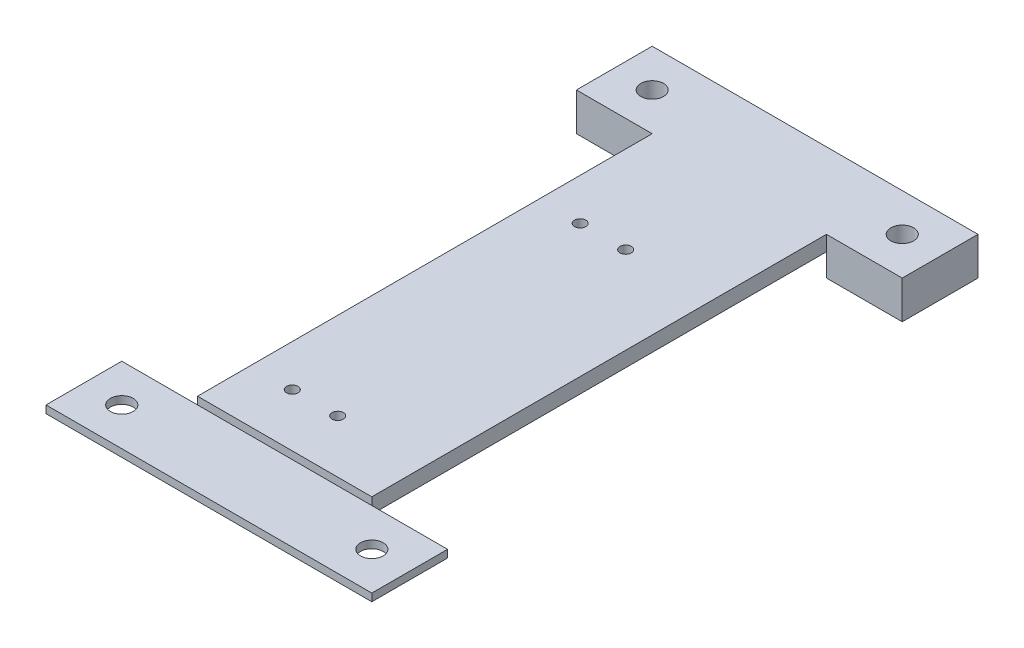
ISO-10303-21;
HEADER;
FILE_DESCRIPTION(('STEP AP214'),'2;1');
FILE_NAME('part.step','',(''),(''),'','','');
FILE_SCHEMA(('AUTOMOTIVE_DESIGN { 1 0 10303 214 1 1 1 1 }'));
ENDSEC;
DATA;
#1=APPLICATION_CONTEXT('core data for automotive mechanical design processes');
#2=APPLICATION_PROTOCOL_DEFINITION('international standard','automotive_design',2000,#1);
#3=PRODUCT_CONTEXT('',#1,'mechanical');
#4=PRODUCT('Part','Part','',(#3));
#5=PRODUCT_RELATED_PRODUCT_CATEGORY('part','',(#4));
#6=PRODUCT_DEFINITION_FORMATION('','',#4);
#7=PRODUCT_DEFINITION_CONTEXT('part definition',#1,'design');
#8=PRODUCT_DEFINITION('design','',#6,#7);
#9=PRODUCT_DEFINITION_SHAPE('','',#8);
#10=(LENGTH_UNIT() NAMED_UNIT(*) SI_UNIT(.MILLI.,.METRE.));
#11=(NAMED_UNIT(*) PLANE_ANGLE_UNIT() SI_UNIT($,.RADIAN.));
#12=(NAMED_UNIT(*) SI_UNIT($,.STERADIAN.) SOLID_ANGLE_UNIT());
#13=UNCERTAINTY_MEASURE_WITH_UNIT(LENGTH_MEASURE(1.E-05),#10,'distance_accuracy_value','');
#14=(GEOMETRIC_REPRESENTATION_CONTEXT(3) GLOBAL_UNCERTAINTY_ASSIGNED_CONTEXT((#13)) GLOBAL_UNIT_ASSIGNED_CONTEXT((#10,
#11,#12)) REPRESENTATION_CONTEXT('',''));
#15=CARTESIAN_POINT('',(0.,0.,0.));
#16=DIRECTION('',(0.,0.,1.));
#17=DIRECTION('',(1.,0.,0.));
#18=AXIS2_PLACEMENT_3D('',#15,#16,#17);
#19=CARTESIAN_POINT('',(20.,4.,-120.));
#20=DIRECTION('',(1.,0.,0.));
#21=DIRECTION('',(0.,0.,-1.));
#22=AXIS2_PLACEMENT_3D('',#19,#20,#21);
#23=PLANE('',#22);
#24=DIRECTION('',(0.,-1.,0.));
#25=VECTOR('',#24,1.);
#26=CARTESIAN_POINT('',(20.,0.,0.));
#27=LINE('',#26,#25);
#28=CARTESIAN_POINT('',(20.,2.,0.));
#29=VERTEX_POINT('',#28);
#30=CARTESIAN_POINT('',(20.,0.,0.));
#31=VERTEX_POINT('',#30);
#32=EDGE_CURVE('E173',#29,#31,#27,.T.);
#33=ORIENTED_EDGE('',*,*,#32,.F.);
#34=DIRECTION('',(0.,-1.,0.));
#35=VECTOR('',#34,1.);
#36=CARTESIAN_POINT('',(20.,4.,0.));
#37=LINE('',#36,#35);
#38=CARTESIAN_POINT('',(20.,4.,0.));
#39=VERTEX_POINT('',#38);
#40=EDGE_CURVE('E308',#39,#29,#37,.T.);
#41=ORIENTED_EDGE('',*,*,#40,.F.);
#42=DIRECTION('',(0.,0.,1.));
#43=VECTOR('',#42,1.);
#44=CARTESIAN_POINT('',(20.,4.,-120.));
#45=LINE('',#44,#43);
#46=CARTESIAN_POINT('',(20.,4.,-120.));
#47=VERTEX_POINT('',#46);
#48=EDGE_CURVE('E279',#47,#39,#45,.T.);
#49=ORIENTED_EDGE('',*,*,#48,.F.);
#50=DIRECTION('',(0.,-1.,0.));
#51=VECTOR('',#50,1.);
#52=CARTESIAN_POINT('',(20.,4.,-120.));
#53=LINE('',#52,#51);
#54=CARTESIAN_POINT('',(20.,0.,-120.));
#55=VERTEX_POINT('',#54);
#56=EDGE_CURVE('E42',#47,#55,#53,.T.);
#57=ORIENTED_EDGE('',*,*,#56,.T.);
#58=DIRECTION('',(0.,0.,1.));
#59=VECTOR('',#58,1.);
#60=CARTESIAN_POINT('',(20.,0.,-120.));
#61=LINE('',#60,#59);
#62=EDGE_CURVE('E273',#55,#31,#61,.T.);
#63=ORIENTED_EDGE('',*,*,#62,.T.);
#64=EDGE_LOOP('',(#33,#41,#49,#57,#63));
#65=FACE_BOUND('',#64,.T.);
#66=ADVANCED_FACE('F34',(#65),#23,.F.);
#67=CARTESIAN_POINT('',(66.,4.,-120.));
#68=DIRECTION('',(-1.,0.,0.));
#69=DIRECTION('',(0.,0.,1.));
#70=AXIS2_PLACEMENT_3D('',#67,#68,#69);
#71=PLANE('',#70);
#72=DIRECTION('',(0.,1.,0.));
#73=VECTOR('',#72,1.);
#74=CARTESIAN_POINT('',(66.,2.,0.));
#75=LINE('',#74,#73);
#76=CARTESIAN_POINT('',(66.,0.,0.));
#77=VERTEX_POINT('',#76);
#78=CARTESIAN_POINT('',(66.,2.,0.));
#79=VERTEX_POINT('',#78);
#80=EDGE_CURVE('E186',#77,#79,#75,.T.);
#81=ORIENTED_EDGE('',*,*,#80,.F.);
#82=DIRECTION('',(0.,0.,-1.));
#83=VECTOR('',#82,1.);
#84=CARTESIAN_POINT('',(66.,0.,-120.));
#85=LINE('',#84,#83);
#86=CARTESIAN_POINT('',(66.,0.,-120.));
#87=VERTEX_POINT('',#86);
#88=EDGE_CURVE('E294',#77,#87,#85,.T.);
#89=ORIENTED_EDGE('',*,*,#88,.T.);
#90=DIRECTION('',(0.,-1.,0.));
#91=VECTOR('',#90,1.);
#92=CARTESIAN_POINT('',(66.,4.,-120.));
#93=LINE('',#92,#91);
#94=CARTESIAN_POINT('',(66.,4.,-120.));
#95=VERTEX_POINT('',#94);
#96=EDGE_CURVE('E302',#95,#87,#93,.T.);
#97=ORIENTED_EDGE('',*,*,#96,.F.);
#98=DIRECTION('',(0.,0.,-1.));
#99=VECTOR('',#98,1.);
#100=CARTESIAN_POINT('',(66.,4.,-120.));
#101=LINE('',#100,#99);
#102=CARTESIAN_POINT('',(66.,4.,0.));
#103=VERTEX_POINT('',#102);
#104=EDGE_CURVE('E283',#103,#95,#101,.T.);
#105=ORIENTED_EDGE('',*,*,#104,.F.);
#106=DIRECTION('',(0.,-1.,0.));
#107=VECTOR('',#106,1.);
#108=CARTESIAN_POINT('',(66.,4.,0.));
#109=LINE('',#108,#107);
#110=EDGE_CURVE('E305',#103,#79,#109,.T.);
#111=ORIENTED_EDGE('',*,*,#110,.T.);
#112=EDGE_LOOP('',(#81,#89,#97,#105,#111));
#113=FACE_BOUND('',#112,.T.);
#114=ADVANCED_FACE('F352',(#113),#71,.F.);
#115=CARTESIAN_POINT('',(66.,4.,0.));
#116=DIRECTION('',(0.,0.,-1.));
#117=DIRECTION('',(-1.,0.,0.));
#118=AXIS2_PLACEMENT_3D('',#115,#116,#117);
#119=PLANE('',#118);
#120=DIRECTION('',(-1.,0.,0.));
#121=VECTOR('',#120,1.);
#122=CARTESIAN_POINT('',(20.,2.,0.));
#123=LINE('',#122,#121);
#124=EDGE_CURVE('E200',#79,#29,#123,.T.);
#125=ORIENTED_EDGE('',*,*,#124,.F.);
#126=ORIENTED_EDGE('',*,*,#110,.F.);
#127=DIRECTION('',(1.,0.,0.));
#128=VECTOR('',#127,1.);
#129=CARTESIAN_POINT('',(66.,4.,0.));
#130=LINE('',#129,#128);
#131=EDGE_CURVE('E281',#39,#103,#130,.T.);
#132=ORIENTED_EDGE('',*,*,#131,.F.);
#133=ORIENTED_EDGE('',*,*,#40,.T.);
#134=EDGE_LOOP('',(#125,#126,#132,#133));
#135=FACE_BOUND('',#134,.T.);
#136=ADVANCED_FACE('F357',(#135),#119,.F.);
#137=CARTESIAN_POINT('',(0.,0.,0.));
#138=DIRECTION('',(0.,1.,0.));
#139=DIRECTION('',(0.,0.,1.));
#140=AXIS2_PLACEMENT_3D('',#137,#138,#139);
#141=PLANE('',#140);
#142=CARTESIAN_POINT('',(10.,0.,10.));
#143=DIRECTION('',(0.,1.,0.));
#144=DIRECTION('',(0.,0.,1.));
#145=AXIS2_PLACEMENT_3D('',#142,#143,#144);
#146=CIRCLE('',#145,3.);
#147=CARTESIAN_POINT('',(10.,0.,13.));
#148=VERTEX_POINT('',#147);
#149=EDGE_CURVE('E175',#148,#148,#146,.T.);
#150=ORIENTED_EDGE('',*,*,#149,.T.);
#151=EDGE_LOOP('',(#150));
#152=FACE_BOUND('',#151,.T.);
#153=CARTESIAN_POINT('',(76.,0.,10.));
#154=DIRECTION('',(0.,1.,0.));
#155=DIRECTION('',(0.,0.,1.));
#156=AXIS2_PLACEMENT_3D('',#153,#154,#155);
#157=CIRCLE('',#156,3.00000000000001);
#158=CARTESIAN_POINT('',(76.,0.,13.));
#159=VERTEX_POINT('',#158);
#160=EDGE_CURVE('E447',#159,#159,#157,.T.);
#161=ORIENTED_EDGE('',*,*,#160,.T.);
#162=EDGE_LOOP('',(#161));
#163=FACE_BOUND('',#162,.T.);
#164=CARTESIAN_POINT('',(43.,0.,-90.));
#165=DIRECTION('',(0.,1.,0.));
#166=DIRECTION('',(0.,0.,1.));
#167=AXIS2_PLACEMENT_3D('',#164,#165,#166);
#168=CIRCLE('',#167,1.5);
#169=CARTESIAN_POINT('',(43.,0.,-88.5));
#170=VERTEX_POINT('',#169);
#171=EDGE_CURVE('E223',#170,#170,#168,.T.);
#172=ORIENTED_EDGE('',*,*,#171,.T.);
#173=EDGE_LOOP('',(#172));
#174=FACE_BOUND('',#173,.T.);
#175=CARTESIAN_POINT('',(31.,0.,-14.));
#176=DIRECTION('',(0.,1.,0.));
#177=DIRECTION('',(0.,0.,1.));
#178=AXIS2_PLACEMENT_3D('',#175,#176,#177);
#179=CIRCLE('',#178,1.5);
#180=CARTESIAN_POINT('',(31.,0.,-12.5));
#181=VERTEX_POINT('',#180);
#182=EDGE_CURVE('E220',#181,#181,#179,.T.);
#183=ORIENTED_EDGE('',*,*,#182,.T.);
#184=EDGE_LOOP('',(#183));
#185=FACE_BOUND('',#184,.T.);
#186=CARTESIAN_POINT('',(43.,0.,-14.));
#187=DIRECTION('',(0.,1.,0.));
#188=DIRECTION('',(0.,0.,1.));
#189=AXIS2_PLACEMENT_3D('',#186,#187,#188);
#190=CIRCLE('',#189,1.5);
#191=CARTESIAN_POINT('',(43.,0.,-12.5));
#192=VERTEX_POINT('',#191);
#193=EDGE_CURVE('E217',#192,#192,#190,.T.);
#194=ORIENTED_EDGE('',*,*,#193,.T.);
#195=EDGE_LOOP('',(#194));
#196=FACE_BOUND('',#195,.T.);
#197=CARTESIAN_POINT('',(31.,0.,-90.));
#198=DIRECTION('',(0.,1.,0.));
#199=DIRECTION('',(0.,0.,1.));
#200=AXIS2_PLACEMENT_3D('',#197,#198,#199);
#201=CIRCLE('',#200,1.5);
#202=CARTESIAN_POINT('',(31.,0.,-88.5));
#203=VERTEX_POINT('',#202);
#204=EDGE_CURVE('E214',#203,#203,#201,.T.);
#205=ORIENTED_EDGE('',*,*,#204,.T.);
#206=EDGE_LOOP('',(#205));
#207=FACE_BOUND('',#206,.T.);
#208=DIRECTION('',(0.,0.,-1.));
#209=VECTOR('',#208,1.);
#210=CARTESIAN_POINT('',(66.,0.,-140.));
#211=LINE('',#210,#209);
#212=CARTESIAN_POINT('',(66.,0.,-140.));
#213=VERTEX_POINT('',#212);
#214=EDGE_CURVE('E229',#87,#213,#211,.T.);
#215=ORIENTED_EDGE('',*,*,#214,.F.);
#216=ORIENTED_EDGE('',*,*,#88,.F.);
#217=DIRECTION('',(-1.,0.,0.));
#218=VECTOR('',#217,1.);
#219=CARTESIAN_POINT('',(86.,0.,0.));
#220=LINE('',#219,#218);
#221=CARTESIAN_POINT('',(86.,0.,0.));
#222=VERTEX_POINT('',#221);
#223=EDGE_CURVE('E198',#222,#77,#220,.T.);
#224=ORIENTED_EDGE('',*,*,#223,.F.);
#225=DIRECTION('',(0.,0.,-1.));
#226=VECTOR('',#225,1.);
#227=CARTESIAN_POINT('',(86.,0.,20.));
#228=LINE('',#227,#226);
#229=CARTESIAN_POINT('',(86.,0.,20.));
#230=VERTEX_POINT('',#229);
#231=EDGE_CURVE('E188',#230,#222,#228,.T.);
#232=ORIENTED_EDGE('',*,*,#231,.F.);
#233=DIRECTION('',(1.,0.,0.));
#234=VECTOR('',#233,1.);
#235=CARTESIAN_POINT('',(20.,0.,20.));
#236=LINE('',#235,#234);
#237=CARTESIAN_POINT('',(0.,0.,20.));
#238=VERTEX_POINT('',#237);
#239=EDGE_CURVE('E158',#238,#230,#236,.T.);
#240=ORIENTED_EDGE('',*,*,#239,.F.);
#241=DIRECTION('',(0.,0.,1.));
#242=VECTOR('',#241,1.);
#243=CARTESIAN_POINT('',(0.,0.,20.));
#244=LINE('',#243,#242);
#245=CARTESIAN_POINT('',(0.,0.,0.));
#246=VERTEX_POINT('',#245);
#247=EDGE_CURVE('E172',#246,#238,#244,.T.);
#248=ORIENTED_EDGE('',*,*,#247,.F.);
#249=DIRECTION('',(1.,0.,0.));
#250=VECTOR('',#249,1.);
#251=CARTESIAN_POINT('',(0.,0.,0.));
#252=LINE('',#251,#250);
#253=EDGE_CURVE('E181',#246,#31,#252,.T.);
#254=ORIENTED_EDGE('',*,*,#253,.T.);
#255=ORIENTED_EDGE('',*,*,#62,.F.);
#256=DIRECTION('',(0.,0.,1.));
#257=VECTOR('',#256,1.);
#258=CARTESIAN_POINT('',(20.,0.,-140.));
#259=LINE('',#258,#257);
#260=CARTESIAN_POINT('',(20.,0.,-140.));
#261=VERTEX_POINT('',#260);
#262=EDGE_CURVE('E248',#261,#55,#259,.T.);
#263=ORIENTED_EDGE('',*,*,#262,.F.);
#264=DIRECTION('',(-1.,0.,0.));
#265=VECTOR('',#264,1.);
#266=CARTESIAN_POINT('',(0.,0.,-140.));
#267=LINE('',#266,#265);
#268=EDGE_CURVE('E54',#213,#261,#267,.T.);
#269=ORIENTED_EDGE('',*,*,#268,.F.);
#270=EDGE_LOOP('',(#215,#216,#224,#232,#240,#248,#254,#255,#263,#269));
#271=FACE_BOUND('',#270,.T.);
#272=ADVANCED_FACE('F372',(#152,#163,#174,#185,#196,#207,#271),#141,.F.);
#273=CARTESIAN_POINT('',(0.,4.,0.));
#274=DIRECTION('',(0.,1.,0.));
#275=DIRECTION('',(0.,0.,1.));
#276=AXIS2_PLACEMENT_3D('',#273,#274,#275);
#277=PLANE('',#276);
#278=CARTESIAN_POINT('',(43.,4.,-90.));
#279=DIRECTION('',(0.,1.,0.));
#280=DIRECTION('',(0.,0.,1.));
#281=AXIS2_PLACEMENT_3D('',#278,#279,#280);
#282=CIRCLE('',#281,1.5);
#283=CARTESIAN_POINT('',(43.,4.,-88.5));
#284=VERTEX_POINT('',#283);
#285=EDGE_CURVE('E206',#284,#284,#282,.T.);
#286=ORIENTED_EDGE('',*,*,#285,.F.);
#287=EDGE_LOOP('',(#286));
#288=FACE_BOUND('',#287,.T.);
#289=CARTESIAN_POINT('',(31.,4.,-14.));
#290=DIRECTION('',(0.,1.,0.));
#291=DIRECTION('',(0.,0.,1.));
#292=AXIS2_PLACEMENT_3D('',#289,#290,#291);
#293=CIRCLE('',#292,1.5);
#294=CARTESIAN_POINT('',(31.,4.,-12.5));
#295=VERTEX_POINT('',#294);
#296=EDGE_CURVE('E205',#295,#295,#293,.T.);
#297=ORIENTED_EDGE('',*,*,#296,.F.);
#298=EDGE_LOOP('',(#297));
#299=FACE_BOUND('',#298,.T.);
#300=CARTESIAN_POINT('',(43.,4.,-14.));
#301=DIRECTION('',(0.,1.,0.));
#302=DIRECTION('',(0.,0.,1.));
#303=AXIS2_PLACEMENT_3D('',#300,#301,#302);
#304=CIRCLE('',#303,1.5);
#305=CARTESIAN_POINT('',(43.,4.,-12.5));
#306=VERTEX_POINT('',#305);
#307=EDGE_CURVE('E157',#306,#306,#304,.T.);
#308=ORIENTED_EDGE('',*,*,#307,.F.);
#309=EDGE_LOOP('',(#308));
#310=FACE_BOUND('',#309,.T.);
#311=CARTESIAN_POINT('',(31.,4.,-90.));
#312=DIRECTION('',(0.,1.,0.));
#313=DIRECTION('',(0.,0.,1.));
#314=AXIS2_PLACEMENT_3D('',#311,#312,#313);
#315=CIRCLE('',#314,1.5);
#316=CARTESIAN_POINT('',(31.,4.,-88.5));
#317=VERTEX_POINT('',#316);
#318=EDGE_CURVE('E209',#317,#317,#315,.T.);
#319=ORIENTED_EDGE('',*,*,#318,.F.);
#320=EDGE_LOOP('',(#319));
#321=FACE_BOUND('',#320,.T.);
#322=CARTESIAN_POINT('',(10.,4.,-130.));
#323=DIRECTION('',(0.,1.,0.));
#324=DIRECTION('',(0.,0.,1.));
#325=AXIS2_PLACEMENT_3D('',#322,#323,#324);
#326=CIRCLE('',#325,3.);
#327=CARTESIAN_POINT('',(10.,4.,-127.));
#328=VERTEX_POINT('',#327);
#329=EDGE_CURVE('E270',#328,#328,#326,.T.);
#330=ORIENTED_EDGE('',*,*,#329,.F.);
#331=EDGE_LOOP('',(#330));
#332=FACE_BOUND('',#331,.T.);
#333=DIRECTION('',(0.,0.,1.));
#334=VECTOR('',#333,1.);
#335=CARTESIAN_POINT('',(0.,4.,-140.));
#336=LINE('',#335,#334);
#337=CARTESIAN_POINT('',(0.,4.,-140.));
#338=VERTEX_POINT('',#337);
#339=CARTESIAN_POINT('',(0.,4.,-120.));
#340=VERTEX_POINT('',#339);
#341=EDGE_CURVE('E274',#338,#340,#336,.T.);
#342=ORIENTED_EDGE('',*,*,#341,.T.);
#343=DIRECTION('',(1.,0.,0.));
#344=VECTOR('',#343,1.);
#345=CARTESIAN_POINT('',(0.,4.,-120.));
#346=LINE('',#345,#344);
#347=EDGE_CURVE('E277',#340,#47,#346,.T.);
#348=ORIENTED_EDGE('',*,*,#347,.T.);
#349=ORIENTED_EDGE('',*,*,#48,.T.);
#350=ORIENTED_EDGE('',*,*,#131,.T.);
#351=ORIENTED_EDGE('',*,*,#104,.T.);
#352=DIRECTION('',(1.,0.,0.));
#353=VECTOR('',#352,1.);
#354=CARTESIAN_POINT('',(86.,4.,-120.));
#355=LINE('',#354,#353);
#356=CARTESIAN_POINT('',(86.,4.,-120.));
#357=VERTEX_POINT('',#356);
#358=EDGE_CURVE('E285',#95,#357,#355,.T.);
#359=ORIENTED_EDGE('',*,*,#358,.T.);
#360=DIRECTION('',(0.,0.,-1.));
#361=VECTOR('',#360,1.);
#362=CARTESIAN_POINT('',(86.,4.,-140.));
#363=LINE('',#362,#361);
#364=CARTESIAN_POINT('',(86.,4.,-140.));
#365=VERTEX_POINT('',#364);
#366=EDGE_CURVE('E287',#357,#365,#363,.T.);
#367=ORIENTED_EDGE('',*,*,#366,.T.);
#368=DIRECTION('',(-1.,0.,0.));
#369=VECTOR('',#368,1.);
#370=CARTESIAN_POINT('',(0.,4.,-140.));
#371=LINE('',#370,#369);
#372=EDGE_CURVE('E289',#365,#338,#371,.T.);
#373=ORIENTED_EDGE('',*,*,#372,.T.);
#374=EDGE_LOOP('',(#342,#348,#349,#350,#351,#359,#367,#373));
#375=FACE_BOUND('',#374,.T.);
#376=CARTESIAN_POINT('',(76.,4.,-130.));
#377=DIRECTION('',(0.,1.,0.));
#378=DIRECTION('',(0.,0.,1.));
#379=AXIS2_PLACEMENT_3D('',#376,#377,#378);
#380=CIRCLE('',#379,3.00000000000001);
#381=CARTESIAN_POINT('',(76.,4.,-127.));
#382=VERTEX_POINT('',#381);
#383=EDGE_CURVE('E267',#382,#382,#380,.T.);
#384=ORIENTED_EDGE('',*,*,#383,.F.);
#385=EDGE_LOOP('',(#384));
#386=FACE_BOUND('',#385,.T.);
#387=ADVANCED_FACE('F368',(#288,#299,#310,#321,#332,#375,#386),#277,.T.);
#388=CARTESIAN_POINT('',(0.,4.,-140.));
#389=DIRECTION('',(1.,0.,0.));
#390=DIRECTION('',(0.,0.,-1.));
#391=AXIS2_PLACEMENT_3D('',#388,#389,#390);
#392=PLANE('',#391);
#393=DIRECTION('',(0.,-1.,0.));
#394=VECTOR('',#393,1.);
#395=CARTESIAN_POINT('',(0.,4.,-140.));
#396=LINE('',#395,#394);
#397=CARTESIAN_POINT('',(0.,-6.,-140.));
#398=VERTEX_POINT('',#397);
#399=EDGE_CURVE('E291',#338,#398,#396,.T.);
#400=ORIENTED_EDGE('',*,*,#399,.T.);
#401=DIRECTION('',(0.,0.,-1.));
#402=VECTOR('',#401,1.);
#403=CARTESIAN_POINT('',(0.,-6.,-140.));
#404=LINE('',#403,#402);
#405=CARTESIAN_POINT('',(0.,-6.,-120.));
#406=VERTEX_POINT('',#405);
#407=EDGE_CURVE('E249',#406,#398,#404,.T.);
#408=ORIENTED_EDGE('',*,*,#407,.F.);
#409=DIRECTION('',(0.,-1.,0.));
#410=VECTOR('',#409,1.);
#411=CARTESIAN_POINT('',(0.,4.,-120.));
#412=LINE('',#411,#410);
#413=EDGE_CURVE('E11',#340,#406,#412,.T.);
#414=ORIENTED_EDGE('',*,*,#413,.F.);
#415=ORIENTED_EDGE('',*,*,#341,.F.);
#416=EDGE_LOOP('',(#400,#408,#414,#415));
#417=FACE_BOUND('',#416,.T.);
#418=ADVANCED_FACE('F36',(#417),#392,.F.);
#419=CARTESIAN_POINT('',(0.,4.,-120.));
#420=DIRECTION('',(0.,0.,-1.));
#421=DIRECTION('',(-1.,0.,0.));
#422=AXIS2_PLACEMENT_3D('',#419,#420,#421);
#423=PLANE('',#422);
#424=ORIENTED_EDGE('',*,*,#413,.T.);
#425=DIRECTION('',(-1.,0.,0.));
#426=VECTOR('',#425,1.);
#427=CARTESIAN_POINT('',(0.,-6.,-120.));
#428=LINE('',#427,#426);
#429=CARTESIAN_POINT('',(20.,-6.,-120.));
#430=VERTEX_POINT('',#429);
#431=EDGE_CURVE('E256',#430,#406,#428,.T.);
#432=ORIENTED_EDGE('',*,*,#431,.F.);
#433=DIRECTION('',(0.,1.,0.));
#434=VECTOR('',#433,1.);
#435=CARTESIAN_POINT('',(20.,-6.,-120.));
#436=LINE('',#435,#434);
#437=EDGE_CURVE('E259',#430,#55,#436,.T.);
#438=ORIENTED_EDGE('',*,*,#437,.T.);
#439=ORIENTED_EDGE('',*,*,#56,.F.);
#440=ORIENTED_EDGE('',*,*,#347,.F.);
#441=EDGE_LOOP('',(#424,#432,#438,#439,#440));
#442=FACE_BOUND('',#441,.T.);
#443=ADVANCED_FACE('F323',(#442),#423,.F.);
#444=CARTESIAN_POINT('',(86.,4.,-120.));
#445=DIRECTION('',(0.,0.,-1.));
#446=DIRECTION('',(-1.,0.,0.));
#447=AXIS2_PLACEMENT_3D('',#444,#445,#446);
#448=PLANE('',#447);
#449=ORIENTED_EDGE('',*,*,#96,.T.);
#450=DIRECTION('',(0.,1.,0.));
#451=VECTOR('',#450,1.);
#452=CARTESIAN_POINT('',(66.,-6.,-120.));
#453=LINE('',#452,#451);
#454=CARTESIAN_POINT('',(66.,-6.,-120.));
#455=VERTEX_POINT('',#454);
#456=EDGE_CURVE('E242',#455,#87,#453,.T.);
#457=ORIENTED_EDGE('',*,*,#456,.F.);
#458=DIRECTION('',(-1.,0.,0.));
#459=VECTOR('',#458,1.);
#460=CARTESIAN_POINT('',(86.,-6.,-120.));
#461=LINE('',#460,#459);
#462=CARTESIAN_POINT('',(86.,-6.,-120.));
#463=VERTEX_POINT('',#462);
#464=EDGE_CURVE('E233',#463,#455,#461,.T.);
#465=ORIENTED_EDGE('',*,*,#464,.F.);
#466=DIRECTION('',(0.,-1.,0.));
#467=VECTOR('',#466,1.);
#468=CARTESIAN_POINT('',(86.,4.,-120.));
#469=LINE('',#468,#467);
#470=EDGE_CURVE('E300',#357,#463,#469,.T.);
#471=ORIENTED_EDGE('',*,*,#470,.F.);
#472=ORIENTED_EDGE('',*,*,#358,.F.);
#473=EDGE_LOOP('',(#449,#457,#465,#471,#472));
#474=FACE_BOUND('',#473,.T.);
#475=ADVANCED_FACE('F347',(#474),#448,.F.);
#476=CARTESIAN_POINT('',(86.,4.,-140.));
#477=DIRECTION('',(-1.,0.,0.));
#478=DIRECTION('',(0.,0.,1.));
#479=AXIS2_PLACEMENT_3D('',#476,#477,#478);
#480=PLANE('',#479);
#481=ORIENTED_EDGE('',*,*,#470,.T.);
#482=DIRECTION('',(0.,0.,1.));
#483=VECTOR('',#482,1.);
#484=CARTESIAN_POINT('',(86.,-6.,-140.));
#485=LINE('',#484,#483);
#486=CARTESIAN_POINT('',(86.,-6.,-140.));
#487=VERTEX_POINT('',#486);
#488=EDGE_CURVE('E230',#487,#463,#485,.T.);
#489=ORIENTED_EDGE('',*,*,#488,.F.);
#490=DIRECTION('',(0.,-1.,0.));
#491=VECTOR('',#490,1.);
#492=CARTESIAN_POINT('',(86.,4.,-140.));
#493=LINE('',#492,#491);
#494=EDGE_CURVE('E298',#365,#487,#493,.T.);
#495=ORIENTED_EDGE('',*,*,#494,.F.);
#496=ORIENTED_EDGE('',*,*,#366,.F.);
#497=EDGE_LOOP('',(#481,#489,#495,#496));
#498=FACE_BOUND('',#497,.T.);
#499=ADVANCED_FACE('F338',(#498),#480,.F.);
#500=CARTESIAN_POINT('',(0.,4.,-140.));
#501=DIRECTION('',(0.,0.,1.));
#502=DIRECTION('',(1.,0.,0.));
#503=AXIS2_PLACEMENT_3D('',#500,#501,#502);
#504=PLANE('',#503);
#505=ORIENTED_EDGE('',*,*,#494,.T.);
#506=DIRECTION('',(1.,0.,0.));
#507=VECTOR('',#506,1.);
#508=CARTESIAN_POINT('',(86.,-6.,-140.));
#509=LINE('',#508,#507);
#510=CARTESIAN_POINT('',(66.,-6.,-140.));
#511=VERTEX_POINT('',#510);
#512=EDGE_CURVE('E237',#511,#487,#509,.T.);
#513=ORIENTED_EDGE('',*,*,#512,.F.);
#514=DIRECTION('',(0.,1.,0.));
#515=VECTOR('',#514,1.);
#516=CARTESIAN_POINT('',(66.,-6.,-140.));
#517=LINE('',#516,#515);
#518=EDGE_CURVE('E49',#511,#213,#517,.T.);
#519=ORIENTED_EDGE('',*,*,#518,.T.);
#520=ORIENTED_EDGE('',*,*,#268,.T.);
#521=DIRECTION('',(0.,1.,0.));
#522=VECTOR('',#521,1.);
#523=CARTESIAN_POINT('',(20.,-6.,-140.));
#524=LINE('',#523,#522);
#525=CARTESIAN_POINT('',(20.,-6.,-140.));
#526=VERTEX_POINT('',#525);
#527=EDGE_CURVE('E264',#526,#261,#524,.T.);
#528=ORIENTED_EDGE('',*,*,#527,.F.);
#529=DIRECTION('',(1.,0.,0.));
#530=VECTOR('',#529,1.);
#531=CARTESIAN_POINT('',(0.,-6.,-140.));
#532=LINE('',#531,#530);
#533=EDGE_CURVE('E252',#398,#526,#532,.T.);
#534=ORIENTED_EDGE('',*,*,#533,.F.);
#535=ORIENTED_EDGE('',*,*,#399,.F.);
#536=ORIENTED_EDGE('',*,*,#372,.F.);
#537=EDGE_LOOP('',(#505,#513,#519,#520,#528,#534,#535,#536));
#538=FACE_BOUND('',#537,.T.);
#539=ADVANCED_FACE('F334',(#538),#504,.F.);
#540=CARTESIAN_POINT('',(10.,4.,-130.));
#541=DIRECTION('',(0.,-1.,0.));
#542=DIRECTION('',(0.,0.,-1.));
#543=AXIS2_PLACEMENT_3D('',#540,#541,#542);
#544=CYLINDRICAL_SURFACE('',#543,3.);
#545=ORIENTED_EDGE('',*,*,#329,.T.);
#546=EDGE_LOOP('',(#545));
#547=FACE_BOUND('',#546,.T.);
#548=CARTESIAN_POINT('',(10.,-6.,-130.));
#549=DIRECTION('',(0.,-1.,0.));
#550=DIRECTION('',(0.,0.,-1.));
#551=AXIS2_PLACEMENT_3D('',#548,#549,#550);
#552=CIRCLE('',#551,3.);
#553=CARTESIAN_POINT('',(10.,-6.,-133.));
#554=VERTEX_POINT('',#553);
#555=EDGE_CURVE('E245',#554,#554,#552,.T.);
#556=ORIENTED_EDGE('',*,*,#555,.T.);
#557=EDGE_LOOP('',(#556));
#558=FACE_BOUND('',#557,.T.);
#559=ADVANCED_FACE('F337',(#547,#558),#544,.F.);
#560=CARTESIAN_POINT('',(76.,4.,-130.));
#561=DIRECTION('',(0.,-1.,0.));
#562=DIRECTION('',(0.,0.,-1.));
#563=AXIS2_PLACEMENT_3D('',#560,#561,#562);
#564=CYLINDRICAL_SURFACE('',#563,3.00000000000001);
#565=ORIENTED_EDGE('',*,*,#383,.T.);
#566=EDGE_LOOP('',(#565));
#567=FACE_BOUND('',#566,.T.);
#568=CARTESIAN_POINT('',(76.,-6.,-130.));
#569=DIRECTION('',(0.,-1.,0.));
#570=DIRECTION('',(0.,0.,-1.));
#571=AXIS2_PLACEMENT_3D('',#568,#569,#570);
#572=CIRCLE('',#571,3.00000000000001);
#573=CARTESIAN_POINT('',(76.,-6.,-133.));
#574=VERTEX_POINT('',#573);
#575=EDGE_CURVE('E226',#574,#574,#572,.T.);
#576=ORIENTED_EDGE('',*,*,#575,.T.);
#577=EDGE_LOOP('',(#576));
#578=FACE_BOUND('',#577,.T.);
#579=ADVANCED_FACE('F344',(#567,#578),#564,.F.);
#580=CARTESIAN_POINT('',(0.,-6.,0.));
#581=DIRECTION('',(0.,1.,0.));
#582=DIRECTION('',(0.,0.,1.));
#583=AXIS2_PLACEMENT_3D('',#580,#581,#582);
#584=PLANE('',#583);
#585=ORIENTED_EDGE('',*,*,#407,.T.);
#586=ORIENTED_EDGE('',*,*,#533,.T.);
#587=DIRECTION('',(0.,0.,1.));
#588=VECTOR('',#587,1.);
#589=CARTESIAN_POINT('',(20.,-6.,-140.));
#590=LINE('',#589,#588);
#591=EDGE_CURVE('E254',#526,#430,#590,.T.);
#592=ORIENTED_EDGE('',*,*,#591,.T.);
#593=ORIENTED_EDGE('',*,*,#431,.T.);
#594=EDGE_LOOP('',(#585,#586,#592,#593));
#595=FACE_BOUND('',#594,.T.);
#596=ORIENTED_EDGE('',*,*,#555,.F.);
#597=EDGE_LOOP('',(#596));
#598=FACE_BOUND('',#597,.T.);
#599=ADVANCED_FACE('F327',(#595,#598),#584,.F.);
#600=CARTESIAN_POINT('',(20.,-6.,-140.));
#601=DIRECTION('',(-1.,0.,0.));
#602=DIRECTION('',(0.,0.,1.));
#603=AXIS2_PLACEMENT_3D('',#600,#601,#602);
#604=PLANE('',#603);
#605=ORIENTED_EDGE('',*,*,#262,.T.);
#606=ORIENTED_EDGE('',*,*,#437,.F.);
#607=ORIENTED_EDGE('',*,*,#591,.F.);
#608=ORIENTED_EDGE('',*,*,#527,.T.);
#609=EDGE_LOOP('',(#605,#606,#607,#608));
#610=FACE_BOUND('',#609,.T.);
#611=ADVANCED_FACE('F319',(#610),#604,.F.);
#612=CARTESIAN_POINT('',(0.,-6.,0.));
#613=DIRECTION('',(0.,-1.,0.));
#614=DIRECTION('',(0.,0.,-1.));
#615=AXIS2_PLACEMENT_3D('',#612,#613,#614);
#616=PLANE('',#615);
#617=ORIENTED_EDGE('',*,*,#488,.T.);
#618=ORIENTED_EDGE('',*,*,#464,.T.);
#619=DIRECTION('',(0.,0.,-1.));
#620=VECTOR('',#619,1.);
#621=CARTESIAN_POINT('',(66.,-6.,-140.));
#622=LINE('',#621,#620);
#623=EDGE_CURVE('E235',#455,#511,#622,.T.);
#624=ORIENTED_EDGE('',*,*,#623,.T.);
#625=ORIENTED_EDGE('',*,*,#512,.T.);
#626=EDGE_LOOP('',(#617,#618,#624,#625));
#627=FACE_BOUND('',#626,.T.);
#628=ORIENTED_EDGE('',*,*,#575,.F.);
#629=EDGE_LOOP('',(#628));
#630=FACE_BOUND('',#629,.T.);
#631=ADVANCED_FACE('F387',(#627,#630),#616,.T.);
#632=CARTESIAN_POINT('',(66.,-6.,-140.));
#633=DIRECTION('',(1.,0.,0.));
#634=DIRECTION('',(0.,0.,-1.));
#635=AXIS2_PLACEMENT_3D('',#632,#633,#634);
#636=PLANE('',#635);
#637=ORIENTED_EDGE('',*,*,#214,.T.);
#638=ORIENTED_EDGE('',*,*,#518,.F.);
#639=ORIENTED_EDGE('',*,*,#623,.F.);
#640=ORIENTED_EDGE('',*,*,#456,.T.);
#641=EDGE_LOOP('',(#637,#638,#639,#640));
#642=FACE_BOUND('',#641,.T.);
#643=ADVANCED_FACE('F390',(#642),#636,.F.);
#644=CARTESIAN_POINT('',(31.,-2.,-90.));
#645=DIRECTION('',(0.,1.,0.));
#646=DIRECTION('',(0.,0.,1.));
#647=AXIS2_PLACEMENT_3D('',#644,#645,#646);
#648=CYLINDRICAL_SURFACE('',#647,1.5);
#649=ORIENTED_EDGE('',*,*,#318,.T.);
#650=EDGE_LOOP('',(#649));
#651=FACE_BOUND('',#650,.T.);
#652=ORIENTED_EDGE('',*,*,#204,.F.);
#653=EDGE_LOOP('',(#652));
#654=FACE_BOUND('',#653,.T.);
#655=ADVANCED_FACE('F393',(#651,#654),#648,.F.);
#656=CARTESIAN_POINT('',(43.,-2.,-14.));
#657=DIRECTION('',(0.,1.,0.));
#658=DIRECTION('',(0.,0.,1.));
#659=AXIS2_PLACEMENT_3D('',#656,#657,#658);
#660=CYLINDRICAL_SURFACE('',#659,1.5);
#661=ORIENTED_EDGE('',*,*,#307,.T.);
#662=EDGE_LOOP('',(#661));
#663=FACE_BOUND('',#662,.T.);
#664=ORIENTED_EDGE('',*,*,#193,.F.);
#665=EDGE_LOOP('',(#664));
#666=FACE_BOUND('',#665,.T.);
#667=ADVANCED_FACE('F400',(#663,#666),#660,.F.);
#668=CARTESIAN_POINT('',(31.,-2.,-14.));
#669=DIRECTION('',(0.,1.,0.));
#670=DIRECTION('',(0.,0.,1.));
#671=AXIS2_PLACEMENT_3D('',#668,#669,#670);
#672=CYLINDRICAL_SURFACE('',#671,1.5);
#673=ORIENTED_EDGE('',*,*,#296,.T.);
#674=EDGE_LOOP('',(#673));
#675=FACE_BOUND('',#674,.T.);
#676=ORIENTED_EDGE('',*,*,#182,.F.);
#677=EDGE_LOOP('',(#676));
#678=FACE_BOUND('',#677,.T.);
#679=ADVANCED_FACE('F402',(#675,#678),#672,.F.);
#680=CARTESIAN_POINT('',(43.,-2.,-90.));
#681=DIRECTION('',(0.,1.,0.));
#682=DIRECTION('',(0.,0.,1.));
#683=AXIS2_PLACEMENT_3D('',#680,#681,#682);
#684=CYLINDRICAL_SURFACE('',#683,1.5);
#685=ORIENTED_EDGE('',*,*,#285,.T.);
#686=EDGE_LOOP('',(#685));
#687=FACE_BOUND('',#686,.T.);
#688=ORIENTED_EDGE('',*,*,#171,.F.);
#689=EDGE_LOOP('',(#688));
#690=FACE_BOUND('',#689,.T.);
#691=ADVANCED_FACE('F405',(#687,#690),#684,.F.);
#692=CARTESIAN_POINT('',(20.,2.,20.));
#693=DIRECTION('',(0.,-1.,0.));
#694=DIRECTION('',(0.,0.,-1.));
#695=AXIS2_PLACEMENT_3D('',#692,#693,#694);
#696=PLANE('',#695);
#697=CARTESIAN_POINT('',(10.,2.,10.));
#698=DIRECTION('',(0.,1.,0.));
#699=DIRECTION('',(0.,0.,1.));
#700=AXIS2_PLACEMENT_3D('',#697,#698,#699);
#701=CIRCLE('',#700,3.);
#702=CARTESIAN_POINT('',(10.,2.,13.));
#703=VERTEX_POINT('',#702);
#704=EDGE_CURVE('E444',#703,#703,#701,.T.);
#705=ORIENTED_EDGE('',*,*,#704,.F.);
#706=EDGE_LOOP('',(#705));
#707=FACE_BOUND('',#706,.T.);
#708=CARTESIAN_POINT('',(76.,2.,10.));
#709=DIRECTION('',(0.,1.,0.));
#710=DIRECTION('',(0.,0.,1.));
#711=AXIS2_PLACEMENT_3D('',#708,#709,#710);
#712=CIRCLE('',#711,3.00000000000001);
#713=CARTESIAN_POINT('',(76.,2.,13.));
#714=VERTEX_POINT('',#713);
#715=EDGE_CURVE('E451',#714,#714,#712,.T.);
#716=ORIENTED_EDGE('',*,*,#715,.F.);
#717=EDGE_LOOP('',(#716));
#718=FACE_BOUND('',#717,.T.);
#719=ORIENTED_EDGE('',*,*,#124,.T.);
#720=DIRECTION('',(1.,0.,0.));
#721=VECTOR('',#720,1.);
#722=CARTESIAN_POINT('',(0.,2.,0.));
#723=LINE('',#722,#721);
#724=CARTESIAN_POINT('',(0.,2.,0.));
#725=VERTEX_POINT('',#724);
#726=EDGE_CURVE('E164',#725,#29,#723,.T.);
#727=ORIENTED_EDGE('',*,*,#726,.F.);
#728=DIRECTION('',(0.,0.,-1.));
#729=VECTOR('',#728,1.);
#730=CARTESIAN_POINT('',(0.,2.,20.));
#731=LINE('',#730,#729);
#732=CARTESIAN_POINT('',(0.,2.,20.));
#733=VERTEX_POINT('',#732);
#734=EDGE_CURVE('E161',#733,#725,#731,.T.);
#735=ORIENTED_EDGE('',*,*,#734,.F.);
#736=DIRECTION('',(-1.,0.,0.));
#737=VECTOR('',#736,1.);
#738=CARTESIAN_POINT('',(20.,2.,20.));
#739=LINE('',#738,#737);
#740=CARTESIAN_POINT('',(86.,2.,20.));
#741=VERTEX_POINT('',#740);
#742=EDGE_CURVE('E147',#741,#733,#739,.T.);
#743=ORIENTED_EDGE('',*,*,#742,.F.);
#744=DIRECTION('',(0.,0.,1.));
#745=VECTOR('',#744,1.);
#746=CARTESIAN_POINT('',(86.,2.,20.));
#747=LINE('',#746,#745);
#748=CARTESIAN_POINT('',(86.,2.,0.));
#749=VERTEX_POINT('',#748);
#750=EDGE_CURVE('E192',#749,#741,#747,.T.);
#751=ORIENTED_EDGE('',*,*,#750,.F.);
#752=DIRECTION('',(-1.,0.,0.));
#753=VECTOR('',#752,1.);
#754=CARTESIAN_POINT('',(86.,2.,0.));
#755=LINE('',#754,#753);
#756=EDGE_CURVE('E194',#749,#79,#755,.T.);
#757=ORIENTED_EDGE('',*,*,#756,.T.);
#758=EDGE_LOOP('',(#719,#727,#735,#743,#751,#757));
#759=FACE_BOUND('',#758,.T.);
#760=ADVANCED_FACE('F163',(#707,#718,#759),#696,.F.);
#761=CARTESIAN_POINT('',(0.,0.,20.));
#762=DIRECTION('',(0.,0.,-1.));
#763=DIRECTION('',(-1.,0.,0.));
#764=AXIS2_PLACEMENT_3D('',#761,#762,#763);
#765=PLANE('',#764);
#766=ORIENTED_EDGE('',*,*,#742,.T.);
#767=DIRECTION('',(0.,1.,0.));
#768=VECTOR('',#767,1.);
#769=CARTESIAN_POINT('',(0.,0.,20.));
#770=LINE('',#769,#768);
#771=EDGE_CURVE('E151',#238,#733,#770,.T.);
#772=ORIENTED_EDGE('',*,*,#771,.F.);
#773=ORIENTED_EDGE('',*,*,#239,.T.);
#774=DIRECTION('',(0.,-1.,0.));
#775=VECTOR('',#774,1.);
#776=CARTESIAN_POINT('',(86.,2.,20.));
#777=LINE('',#776,#775);
#778=EDGE_CURVE('E153',#741,#230,#777,.T.);
#779=ORIENTED_EDGE('',*,*,#778,.F.);
#780=EDGE_LOOP('',(#766,#772,#773,#779));
#781=FACE_BOUND('',#780,.T.);
#782=ADVANCED_FACE('F149',(#781),#765,.F.);
#783=CARTESIAN_POINT('',(86.,2.,0.));
#784=DIRECTION('',(0.,0.,1.));
#785=DIRECTION('',(1.,0.,0.));
#786=AXIS2_PLACEMENT_3D('',#783,#784,#785);
#787=PLANE('',#786);
#788=ORIENTED_EDGE('',*,*,#80,.T.);
#789=ORIENTED_EDGE('',*,*,#756,.F.);
#790=DIRECTION('',(0.,1.,0.));
#791=VECTOR('',#790,1.);
#792=CARTESIAN_POINT('',(86.,2.,0.));
#793=LINE('',#792,#791);
#794=EDGE_CURVE('E190',#222,#749,#793,.T.);
#795=ORIENTED_EDGE('',*,*,#794,.F.);
#796=ORIENTED_EDGE('',*,*,#223,.T.);
#797=EDGE_LOOP('',(#788,#789,#795,#796));
#798=FACE_BOUND('',#797,.T.);
#799=ADVANCED_FACE('F418',(#798),#787,.F.);
#800=CARTESIAN_POINT('',(86.,0.,0.));
#801=DIRECTION('',(1.,0.,0.));
#802=DIRECTION('',(0.,0.,-1.));
#803=AXIS2_PLACEMENT_3D('',#800,#801,#802);
#804=PLANE('',#803);
#805=ORIENTED_EDGE('',*,*,#778,.T.);
#806=ORIENTED_EDGE('',*,*,#231,.T.);
#807=ORIENTED_EDGE('',*,*,#794,.T.);
#808=ORIENTED_EDGE('',*,*,#750,.T.);
#809=EDGE_LOOP('',(#805,#806,#807,#808));
#810=FACE_BOUND('',#809,.T.);
#811=ADVANCED_FACE('F421',(#810),#804,.T.);
#812=CARTESIAN_POINT('',(0.,0.,0.));
#813=DIRECTION('',(0.,0.,1.));
#814=DIRECTION('',(1.,0.,0.));
#815=AXIS2_PLACEMENT_3D('',#812,#813,#814);
#816=PLANE('',#815);
#817=ORIENTED_EDGE('',*,*,#32,.T.);
#818=ORIENTED_EDGE('',*,*,#253,.F.);
#819=DIRECTION('',(0.,-1.,0.));
#820=VECTOR('',#819,1.);
#821=CARTESIAN_POINT('',(0.,0.,0.));
#822=LINE('',#821,#820);
#823=EDGE_CURVE('E167',#725,#246,#822,.T.);
#824=ORIENTED_EDGE('',*,*,#823,.F.);
#825=ORIENTED_EDGE('',*,*,#726,.T.);
#826=EDGE_LOOP('',(#817,#818,#824,#825));
#827=FACE_BOUND('',#826,.T.);
#828=ADVANCED_FACE('F425',(#827),#816,.F.);
#829=CARTESIAN_POINT('',(0.,0.,0.));
#830=DIRECTION('',(-1.,0.,0.));
#831=DIRECTION('',(0.,0.,1.));
#832=AXIS2_PLACEMENT_3D('',#829,#830,#831);
#833=PLANE('',#832);
#834=ORIENTED_EDGE('',*,*,#771,.T.);
#835=ORIENTED_EDGE('',*,*,#734,.T.);
#836=ORIENTED_EDGE('',*,*,#823,.T.);
#837=ORIENTED_EDGE('',*,*,#247,.T.);
#838=EDGE_LOOP('',(#834,#835,#836,#837));
#839=FACE_BOUND('',#838,.T.);
#840=ADVANCED_FACE('F170',(#839),#833,.T.);
#841=CARTESIAN_POINT('',(76.,-18.,10.));
#842=DIRECTION('',(0.,1.,0.));
#843=DIRECTION('',(0.,0.,1.));
#844=AXIS2_PLACEMENT_3D('',#841,#842,#843);
#845=CYLINDRICAL_SURFACE('',#844,3.00000000000001);
#846=ORIENTED_EDGE('',*,*,#715,.T.);
#847=EDGE_LOOP('',(#846));
#848=FACE_BOUND('',#847,.T.);
#849=ORIENTED_EDGE('',*,*,#160,.F.);
#850=EDGE_LOOP('',(#849));
#851=FACE_BOUND('',#850,.T.);
#852=ADVANCED_FACE('F432',(#848,#851),#845,.F.);
#853=CARTESIAN_POINT('',(10.,-18.,10.));
#854=DIRECTION('',(0.,1.,0.));
#855=DIRECTION('',(0.,0.,1.));
#856=AXIS2_PLACEMENT_3D('',#853,#854,#855);
#857=CYLINDRICAL_SURFACE('',#856,3.);
#858=ORIENTED_EDGE('',*,*,#704,.T.);
#859=EDGE_LOOP('',(#858));
#860=FACE_BOUND('',#859,.T.);
#861=ORIENTED_EDGE('',*,*,#149,.F.);
#862=EDGE_LOOP('',(#861));
#863=FACE_BOUND('',#862,.T.);
#864=ADVANCED_FACE('F435',(#860,#863),#857,.F.);
#865=CLOSED_SHELL('',(#66,#114,#136,#272,#387,#418,#443,#475,#499,#539,#559,#579,#599,#611,#631,
#643,#655,#667,#679,#691,#760,#782,#799,#811,#828,#840,#852,#864));
#866=MANIFOLD_SOLID_BREP('B2',#865);
#867=ADVANCED_BREP_SHAPE_REPRESENTATION('',(#18,#866),#14);
#868=SHAPE_DEFINITION_REPRESENTATION(#9,#867);
ENDSEC;
END-ISO-10303-21;
